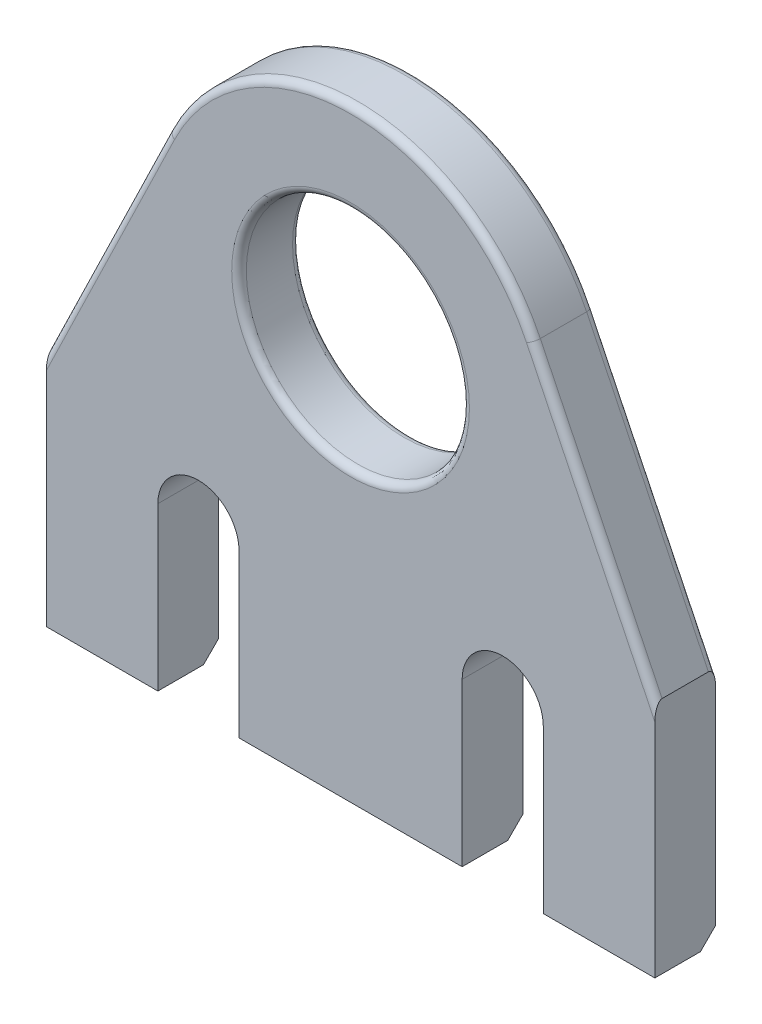
ISO-10303-21;
HEADER;
FILE_DESCRIPTION(('STEP AP214'),'2;1');
FILE_NAME('part.step','',(''),(''),'','','');
FILE_SCHEMA(('AUTOMOTIVE_DESIGN { 1 0 10303 214 1 1 1 1 }'));
ENDSEC;
DATA;
#1=APPLICATION_CONTEXT('core data for automotive mechanical design processes');
#2=APPLICATION_PROTOCOL_DEFINITION('international standard','automotive_design',2000,#1);
#3=PRODUCT_CONTEXT('',#1,'mechanical');
#4=PRODUCT('Part','Part','',(#3));
#5=PRODUCT_RELATED_PRODUCT_CATEGORY('part','',(#4));
#6=PRODUCT_DEFINITION_FORMATION('','',#4);
#7=PRODUCT_DEFINITION_CONTEXT('part definition',#1,'design');
#8=PRODUCT_DEFINITION('design','',#6,#7);
#9=PRODUCT_DEFINITION_SHAPE('','',#8);
#10=(LENGTH_UNIT() NAMED_UNIT(*) SI_UNIT(.MILLI.,.METRE.));
#11=(NAMED_UNIT(*) PLANE_ANGLE_UNIT() SI_UNIT($,.RADIAN.));
#12=(NAMED_UNIT(*) SI_UNIT($,.STERADIAN.) SOLID_ANGLE_UNIT());
#13=UNCERTAINTY_MEASURE_WITH_UNIT(LENGTH_MEASURE(1.E-05),#10,'distance_accuracy_value','');
#14=(GEOMETRIC_REPRESENTATION_CONTEXT(3) GLOBAL_UNCERTAINTY_ASSIGNED_CONTEXT((#13)) GLOBAL_UNIT_ASSIGNED_CONTEXT((#10,
#11,#12)) REPRESENTATION_CONTEXT('',''));
#15=CARTESIAN_POINT('',(0.,0.,0.));
#16=DIRECTION('',(0.,0.,1.));
#17=DIRECTION('',(1.,0.,0.));
#18=AXIS2_PLACEMENT_3D('',#15,#16,#17);
#19=CARTESIAN_POINT('',(-47.625,-74.6252000000001,-19.05));
#20=DIRECTION('',(0.,0.,1.));
#21=DIRECTION('',(1.,0.,0.));
#22=AXIS2_PLACEMENT_3D('',#19,#20,#21);
#23=CYLINDRICAL_SURFACE('',#22,12.7);
#24=CARTESIAN_POINT('',(-47.625,-74.6252000000001,0.));
#25=DIRECTION('',(0.,0.,-1.));
#26=DIRECTION('',(1.,0.,0.));
#27=AXIS2_PLACEMENT_3D('',#24,#25,#26);
#28=CIRCLE('',#27,12.7);
#29=CARTESIAN_POINT('',(-60.325,-74.6252000000001,0.));
#30=VERTEX_POINT('',#29);
#31=CARTESIAN_POINT('',(-34.925,-74.6252000000001,0.));
#32=VERTEX_POINT('',#31);
#33=EDGE_CURVE('E204',#30,#32,#28,.T.);
#34=ORIENTED_EDGE('',*,*,#33,.F.);
#35=DIRECTION('',(0.,0.,1.));
#36=VECTOR('',#35,1.);
#37=CARTESIAN_POINT('',(-60.325,-74.6252000000001,-19.05));
#38=LINE('',#37,#36);
#39=CARTESIAN_POINT('',(-60.325,-74.6252000000001,-19.05));
#40=VERTEX_POINT('',#39);
#41=EDGE_CURVE('E272',#40,#30,#38,.T.);
#42=ORIENTED_EDGE('',*,*,#41,.F.);
#43=CARTESIAN_POINT('',(-47.625,-74.6252000000001,-19.05));
#44=DIRECTION('',(0.,0.,-1.));
#45=DIRECTION('',(1.,0.,0.));
#46=AXIS2_PLACEMENT_3D('',#43,#44,#45);
#47=CIRCLE('',#46,12.7);
#48=CARTESIAN_POINT('',(-34.925,-74.6252000000001,-19.05));
#49=VERTEX_POINT('',#48);
#50=EDGE_CURVE('E207',#40,#49,#47,.T.);
#51=ORIENTED_EDGE('',*,*,#50,.T.);
#52=DIRECTION('',(0.,0.,1.));
#53=VECTOR('',#52,1.);
#54=CARTESIAN_POINT('',(-34.925,-74.6252000000001,-19.05));
#55=LINE('',#54,#53);
#56=EDGE_CURVE('E200',#49,#32,#55,.T.);
#57=ORIENTED_EDGE('',*,*,#56,.T.);
#58=EDGE_LOOP('',(#34,#42,#51,#57));
#59=FACE_BOUND('',#58,.T.);
#60=ADVANCED_FACE('F59',(#59),#23,.F.);
#61=CARTESIAN_POINT('',(-60.325,-74.6252000000001,-19.05));
#62=DIRECTION('',(1.,0.,0.));
#63=DIRECTION('',(0.,1.,0.));
#64=AXIS2_PLACEMENT_3D('',#61,#62,#63);
#65=PLANE('',#64);
#66=DIRECTION('',(0.,0.,1.));
#67=VECTOR('',#66,1.);
#68=CARTESIAN_POINT('',(-60.325,-125.4252,-19.05));
#69=LINE('',#68,#67);
#70=CARTESIAN_POINT('',(-60.325,-125.4252,-14.2748));
#71=VERTEX_POINT('',#70);
#72=CARTESIAN_POINT('',(-60.325,-125.4252,0.));
#73=VERTEX_POINT('',#72);
#74=EDGE_CURVE('E275',#71,#73,#69,.T.);
#75=ORIENTED_EDGE('',*,*,#74,.F.);
#76=DIRECTION('',(0.,0.707106781186548,-0.707106781186546));
#77=VECTOR('',#76,1.);
#78=CARTESIAN_POINT('',(-60.325,-97.6376000000001,-42.0624));
#79=LINE('',#78,#77);
#80=CARTESIAN_POINT('',(-60.325,-120.65,-19.05));
#81=VERTEX_POINT('',#80);
#82=EDGE_CURVE('E326',#71,#81,#79,.T.);
#83=ORIENTED_EDGE('',*,*,#82,.T.);
#84=DIRECTION('',(0.,1.,0.));
#85=VECTOR('',#84,1.);
#86=CARTESIAN_POINT('',(-60.325,-74.6252000000001,-19.05));
#87=LINE('',#86,#85);
#88=EDGE_CURVE('E212',#81,#40,#87,.T.);
#89=ORIENTED_EDGE('',*,*,#88,.T.);
#90=ORIENTED_EDGE('',*,*,#41,.T.);
#91=DIRECTION('',(0.,1.,0.));
#92=VECTOR('',#91,1.);
#93=CARTESIAN_POINT('',(-60.325,-74.6252000000001,0.));
#94=LINE('',#93,#92);
#95=EDGE_CURVE('E227',#73,#30,#94,.T.);
#96=ORIENTED_EDGE('',*,*,#95,.F.);
#97=EDGE_LOOP('',(#75,#83,#89,#90,#96));
#98=FACE_BOUND('',#97,.T.);
#99=ADVANCED_FACE('F454',(#98),#65,.T.);
#100=CARTESIAN_POINT('',(-60.325,-125.4252,-19.05));
#101=DIRECTION('',(0.,-1.,0.));
#102=DIRECTION('',(0.,0.,-1.));
#103=AXIS2_PLACEMENT_3D('',#100,#101,#102);
#104=PLANE('',#103);
#105=DIRECTION('',(0.,0.,1.));
#106=VECTOR('',#105,1.);
#107=CARTESIAN_POINT('',(-95.25,-125.4252,-19.05));
#108=LINE('',#107,#106);
#109=CARTESIAN_POINT('',(-95.25,-125.4252,-14.2748));
#110=VERTEX_POINT('',#109);
#111=CARTESIAN_POINT('',(-95.25,-125.4252,0.));
#112=VERTEX_POINT('',#111);
#113=EDGE_CURVE('E277',#110,#112,#108,.T.);
#114=ORIENTED_EDGE('',*,*,#113,.F.);
#115=DIRECTION('',(1.,0.,0.));
#116=VECTOR('',#115,1.);
#117=CARTESIAN_POINT('',(-60.325,-125.4252,-14.2748));
#118=LINE('',#117,#116);
#119=EDGE_CURVE('E323',#110,#71,#118,.T.);
#120=ORIENTED_EDGE('',*,*,#119,.T.);
#121=ORIENTED_EDGE('',*,*,#74,.T.);
#122=DIRECTION('',(1.,0.,0.));
#123=VECTOR('',#122,1.);
#124=CARTESIAN_POINT('',(-60.325,-125.4252,0.));
#125=LINE('',#124,#123);
#126=EDGE_CURVE('E252',#112,#73,#125,.T.);
#127=ORIENTED_EDGE('',*,*,#126,.F.);
#128=EDGE_LOOP('',(#114,#120,#121,#127));
#129=FACE_BOUND('',#128,.T.);
#130=ADVANCED_FACE('F461',(#129),#104,.T.);
#131=CARTESIAN_POINT('',(-95.25,-125.4252,-19.05));
#132=DIRECTION('',(-1.,0.,0.));
#133=DIRECTION('',(0.,-1.,0.));
#134=AXIS2_PLACEMENT_3D('',#131,#132,#133);
#135=PLANE('',#134);
#136=DIRECTION('',(0.,-1.,0.));
#137=VECTOR('',#136,1.);
#138=CARTESIAN_POINT('',(-95.25,-125.4252,0.));
#139=LINE('',#138,#137);
#140=CARTESIAN_POINT('',(-95.25,-56.0343164939209,0.));
#141=VERTEX_POINT('',#140);
#142=EDGE_CURVE('E250',#141,#112,#139,.T.);
#143=ORIENTED_EDGE('',*,*,#142,.F.);
#144=CARTESIAN_POINT('',(-95.25,-56.0343164939209,-2.28599999999998));
#145=DIRECTION('',(-1.,0.,0.));
#146=DIRECTION('',(0.,-1.,0.));
#147=AXIS2_PLACEMENT_3D('',#144,#145,#146);
#148=ELLIPSE('',#147,5.23431649392085,2.286);
#149=CARTESIAN_POINT('',(-95.25,-50.8,-2.286));
#150=VERTEX_POINT('',#149);
#151=EDGE_CURVE('E351',#141,#150,#148,.T.);
#152=ORIENTED_EDGE('',*,*,#151,.T.);
#153=DIRECTION('',(0.,0.,1.));
#154=VECTOR('',#153,1.);
#155=CARTESIAN_POINT('',(-95.25,-50.8,-19.05));
#156=LINE('',#155,#154);
#157=CARTESIAN_POINT('',(-95.25,-50.8000000000001,-16.764));
#158=VERTEX_POINT('',#157);
#159=EDGE_CURVE('E280',#158,#150,#156,.T.);
#160=ORIENTED_EDGE('',*,*,#159,.F.);
#161=CARTESIAN_POINT('',(-95.25,-56.034316493921,-16.764));
#162=DIRECTION('',(-1.,0.,0.));
#163=DIRECTION('',(0.,1.,0.));
#164=AXIS2_PLACEMENT_3D('',#161,#162,#163);
#165=ELLIPSE('',#164,5.23431649392085,2.286);
#166=CARTESIAN_POINT('',(-95.25,-56.0343164939209,-19.05));
#167=VERTEX_POINT('',#166);
#168=EDGE_CURVE('E349',#158,#167,#165,.T.);
#169=ORIENTED_EDGE('',*,*,#168,.T.);
#170=DIRECTION('',(0.,-1.,0.));
#171=VECTOR('',#170,1.);
#172=CARTESIAN_POINT('',(-95.25,-125.4252,-19.05));
#173=LINE('',#172,#171);
#174=CARTESIAN_POINT('',(-95.25,-120.65,-19.05));
#175=VERTEX_POINT('',#174);
#176=EDGE_CURVE('E269',#167,#175,#173,.T.);
#177=ORIENTED_EDGE('',*,*,#176,.T.);
#178=DIRECTION('',(0.,-0.707106781186548,0.707106781186547));
#179=VECTOR('',#178,1.);
#180=CARTESIAN_POINT('',(-95.25,-123.0376,-16.6624));
#181=LINE('',#180,#179);
#182=EDGE_CURVE('E328',#175,#110,#181,.T.);
#183=ORIENTED_EDGE('',*,*,#182,.T.);
#184=ORIENTED_EDGE('',*,*,#113,.T.);
#185=EDGE_LOOP('',(#143,#152,#160,#169,#177,#183,#184));
#186=FACE_BOUND('',#185,.T.);
#187=ADVANCED_FACE('F448',(#186),#135,.T.);
#188=CARTESIAN_POINT('',(-95.25,-50.8,-19.05));
#189=DIRECTION('',(-0.899591061172803,0.436733239699006,0.));
#190=DIRECTION('',(-0.436733239699006,-0.899591061172803,0.));
#191=AXIS2_PLACEMENT_3D('',#188,#189,#190);
#192=PLANE('',#191);
#193=ORIENTED_EDGE('',*,*,#159,.T.);
#194=DIRECTION('',(-0.436733239699006,-0.899591061172803,0.));
#195=VECTOR('',#194,1.);
#196=CARTESIAN_POINT('',(-95.25,-50.8,-2.28599999999999));
#197=LINE('',#196,#195);
#198=CARTESIAN_POINT('',(-57.124032384473,27.7325607208869,-2.286));
#199=VERTEX_POINT('',#198);
#200=EDGE_CURVE('E355',#150,#199,#197,.F.);
#201=ORIENTED_EDGE('',*,*,#200,.T.);
#202=DIRECTION('',(0.,0.,1.));
#203=VECTOR('',#202,1.);
#204=CARTESIAN_POINT('',(-57.124032384473,27.7325607208869,-19.05));
#205=LINE('',#204,#203);
#206=CARTESIAN_POINT('',(-57.124032384473,27.7325607208869,-16.764));
#207=VERTEX_POINT('',#206);
#208=EDGE_CURVE('E283',#207,#199,#205,.T.);
#209=ORIENTED_EDGE('',*,*,#208,.F.);
#210=DIRECTION('',(-0.436733239699006,-0.899591061172803,0.));
#211=VECTOR('',#210,1.);
#212=CARTESIAN_POINT('',(-95.25,-50.8000000000001,-16.764));
#213=LINE('',#212,#211);
#214=EDGE_CURVE('E353',#207,#158,#213,.T.);
#215=ORIENTED_EDGE('',*,*,#214,.T.);
#216=EDGE_LOOP('',(#193,#201,#209,#215));
#217=FACE_BOUND('',#216,.T.);
#218=ADVANCED_FACE('F380',(#217),#192,.T.);
#219=CARTESIAN_POINT('',(0.,0.,-19.05));
#220=DIRECTION('',(0.,0.,1.));
#221=DIRECTION('',(1.,0.,0.));
#222=AXIS2_PLACEMENT_3D('',#219,#220,#221);
#223=CYLINDRICAL_SURFACE('',#222,63.5);
#224=ORIENTED_EDGE('',*,*,#208,.T.);
#225=CARTESIAN_POINT('',(0.,0.,-2.286));
#226=DIRECTION('',(0.,0.,1.));
#227=DIRECTION('',(1.,0.,0.));
#228=AXIS2_PLACEMENT_3D('',#225,#226,#227);
#229=CIRCLE('',#228,63.5);
#230=CARTESIAN_POINT('',(57.124032384473,27.7325607208867,-2.286));
#231=VERTEX_POINT('',#230);
#232=EDGE_CURVE('E12',#199,#231,#229,.F.);
#233=ORIENTED_EDGE('',*,*,#232,.T.);
#234=DIRECTION('',(0.,0.,1.));
#235=VECTOR('',#234,1.);
#236=CARTESIAN_POINT('',(57.124032384473,27.7325607208867,-19.05));
#237=LINE('',#236,#235);
#238=CARTESIAN_POINT('',(57.124032384473,27.7325607208867,-16.764));
#239=VERTEX_POINT('',#238);
#240=EDGE_CURVE('E286',#239,#231,#237,.T.);
#241=ORIENTED_EDGE('',*,*,#240,.F.);
#242=CARTESIAN_POINT('',(0.,0.,-16.764));
#243=DIRECTION('',(0.,0.,1.));
#244=DIRECTION('',(1.,0.,0.));
#245=AXIS2_PLACEMENT_3D('',#242,#243,#244);
#246=CIRCLE('',#245,63.5);
#247=EDGE_CURVE('E66',#239,#207,#246,.T.);
#248=ORIENTED_EDGE('',*,*,#247,.T.);
#249=EDGE_LOOP('',(#224,#233,#241,#248));
#250=FACE_BOUND('',#249,.T.);
#251=ADVANCED_FACE('F373',(#250),#223,.T.);
#252=CARTESIAN_POINT('',(95.25,-50.8,-19.05));
#253=DIRECTION('',(0.899591061172804,0.436733239699006,0.));
#254=DIRECTION('',(-0.436733239699006,0.899591061172803,0.));
#255=AXIS2_PLACEMENT_3D('',#252,#253,#254);
#256=PLANE('',#255);
#257=ORIENTED_EDGE('',*,*,#240,.T.);
#258=DIRECTION('',(-0.436733239699006,0.899591061172803,0.));
#259=VECTOR('',#258,1.);
#260=CARTESIAN_POINT('',(95.25,-50.8,-2.28600000000001));
#261=LINE('',#260,#259);
#262=CARTESIAN_POINT('',(95.25,-50.8,-2.28600000000001));
#263=VERTEX_POINT('',#262);
#264=EDGE_CURVE('E343',#231,#263,#261,.F.);
#265=ORIENTED_EDGE('',*,*,#264,.T.);
#266=DIRECTION('',(0.,0.,1.));
#267=VECTOR('',#266,1.);
#268=CARTESIAN_POINT('',(95.25,-50.8,-19.05));
#269=LINE('',#268,#267);
#270=CARTESIAN_POINT('',(95.25,-50.8,-16.764));
#271=VERTEX_POINT('',#270);
#272=EDGE_CURVE('E289',#271,#263,#269,.T.);
#273=ORIENTED_EDGE('',*,*,#272,.F.);
#274=DIRECTION('',(-0.436733239699006,0.899591061172803,0.));
#275=VECTOR('',#274,1.);
#276=CARTESIAN_POINT('',(57.124032384473,27.7325607208867,-16.764));
#277=LINE('',#276,#275);
#278=EDGE_CURVE('E340',#271,#239,#277,.T.);
#279=ORIENTED_EDGE('',*,*,#278,.T.);
#280=EDGE_LOOP('',(#257,#265,#273,#279));
#281=FACE_BOUND('',#280,.T.);
#282=ADVANCED_FACE('F504',(#281),#256,.T.);
#283=CARTESIAN_POINT('',(95.25,-125.4252,-19.05));
#284=DIRECTION('',(1.,0.,0.));
#285=DIRECTION('',(0.,1.,0.));
#286=AXIS2_PLACEMENT_3D('',#283,#284,#285);
#287=PLANE('',#286);
#288=ORIENTED_EDGE('',*,*,#272,.T.);
#289=CARTESIAN_POINT('',(95.2499999999999,-56.0343164939208,-2.286));
#290=DIRECTION('',(1.,0.,0.));
#291=DIRECTION('',(0.,1.,0.));
#292=AXIS2_PLACEMENT_3D('',#289,#290,#291);
#293=ELLIPSE('',#292,5.23431649392086,2.286);
#294=CARTESIAN_POINT('',(95.25,-56.0343164939208,0.));
#295=VERTEX_POINT('',#294);
#296=EDGE_CURVE('E347',#263,#295,#293,.T.);
#297=ORIENTED_EDGE('',*,*,#296,.T.);
#298=DIRECTION('',(0.,1.,0.));
#299=VECTOR('',#298,1.);
#300=CARTESIAN_POINT('',(95.25,-125.4252,0.));
#301=LINE('',#300,#299);
#302=CARTESIAN_POINT('',(95.25,-125.4252,0.));
#303=VERTEX_POINT('',#302);
#304=EDGE_CURVE('E248',#303,#295,#301,.T.);
#305=ORIENTED_EDGE('',*,*,#304,.F.);
#306=DIRECTION('',(0.,0.,1.));
#307=VECTOR('',#306,1.);
#308=CARTESIAN_POINT('',(95.25,-125.4252,-19.05));
#309=LINE('',#308,#307);
#310=CARTESIAN_POINT('',(95.25,-125.4252,-14.2748));
#311=VERTEX_POINT('',#310);
#312=EDGE_CURVE('E292',#311,#303,#309,.T.);
#313=ORIENTED_EDGE('',*,*,#312,.F.);
#314=DIRECTION('',(0.,0.707106781186548,-0.707106781186547));
#315=VECTOR('',#314,1.);
#316=CARTESIAN_POINT('',(95.25,-123.0376,-16.6624));
#317=LINE('',#316,#315);
#318=CARTESIAN_POINT('',(95.25,-120.65,-19.05));
#319=VERTEX_POINT('',#318);
#320=EDGE_CURVE('E305',#311,#319,#317,.T.);
#321=ORIENTED_EDGE('',*,*,#320,.T.);
#322=DIRECTION('',(0.,1.,0.));
#323=VECTOR('',#322,1.);
#324=CARTESIAN_POINT('',(95.25,-125.4252,-19.05));
#325=LINE('',#324,#323);
#326=CARTESIAN_POINT('',(95.25,-56.0343164939209,-19.05));
#327=VERTEX_POINT('',#326);
#328=EDGE_CURVE('E266',#319,#327,#325,.T.);
#329=ORIENTED_EDGE('',*,*,#328,.T.);
#330=CARTESIAN_POINT('',(95.25,-56.034316493921,-16.764));
#331=DIRECTION('',(1.,0.,0.));
#332=DIRECTION('',(0.,-1.,0.));
#333=AXIS2_PLACEMENT_3D('',#330,#331,#332);
#334=ELLIPSE('',#333,5.23431649392086,2.286);
#335=EDGE_CURVE('E345',#327,#271,#334,.T.);
#336=ORIENTED_EDGE('',*,*,#335,.T.);
#337=EDGE_LOOP('',(#288,#297,#305,#313,#321,#329,#336));
#338=FACE_BOUND('',#337,.T.);
#339=ADVANCED_FACE('F399',(#338),#287,.T.);
#340=CARTESIAN_POINT('',(60.325,-125.4252,-19.05));
#341=DIRECTION('',(0.,-1.,0.));
#342=DIRECTION('',(1.,0.,0.));
#343=AXIS2_PLACEMENT_3D('',#340,#341,#342);
#344=PLANE('',#343);
#345=DIRECTION('',(0.,0.,1.));
#346=VECTOR('',#345,1.);
#347=CARTESIAN_POINT('',(60.325,-125.4252,-19.05));
#348=LINE('',#347,#346);
#349=CARTESIAN_POINT('',(60.325,-125.4252,-14.2748));
#350=VERTEX_POINT('',#349);
#351=CARTESIAN_POINT('',(60.325,-125.4252,0.));
#352=VERTEX_POINT('',#351);
#353=EDGE_CURVE('E294',#350,#352,#348,.T.);
#354=ORIENTED_EDGE('',*,*,#353,.F.);
#355=DIRECTION('',(1.,0.,0.));
#356=VECTOR('',#355,1.);
#357=CARTESIAN_POINT('',(95.2500000000001,-125.4252,-14.2748));
#358=LINE('',#357,#356);
#359=EDGE_CURVE('E274',#350,#311,#358,.T.);
#360=ORIENTED_EDGE('',*,*,#359,.T.);
#361=ORIENTED_EDGE('',*,*,#312,.T.);
#362=DIRECTION('',(1.,0.,0.));
#363=VECTOR('',#362,1.);
#364=CARTESIAN_POINT('',(60.325,-125.4252,0.));
#365=LINE('',#364,#363);
#366=EDGE_CURVE('E245',#352,#303,#365,.T.);
#367=ORIENTED_EDGE('',*,*,#366,.F.);
#368=EDGE_LOOP('',(#354,#360,#361,#367));
#369=FACE_BOUND('',#368,.T.);
#370=ADVANCED_FACE('F409',(#369),#344,.T.);
#371=CARTESIAN_POINT('',(60.325,-74.6252000000001,-19.05));
#372=DIRECTION('',(-1.,0.,0.));
#373=DIRECTION('',(0.,-1.,0.));
#374=AXIS2_PLACEMENT_3D('',#371,#372,#373);
#375=PLANE('',#374);
#376=DIRECTION('',(0.,-1.,0.));
#377=VECTOR('',#376,1.);
#378=CARTESIAN_POINT('',(60.325,-74.6252000000001,-19.05));
#379=LINE('',#378,#377);
#380=CARTESIAN_POINT('',(60.325,-74.6252000000001,-19.05));
#381=VERTEX_POINT('',#380);
#382=CARTESIAN_POINT('',(60.325,-120.65,-19.05));
#383=VERTEX_POINT('',#382);
#384=EDGE_CURVE('E263',#381,#383,#379,.T.);
#385=ORIENTED_EDGE('',*,*,#384,.T.);
#386=DIRECTION('',(0.,-0.707106781186548,0.707106781186547));
#387=VECTOR('',#386,1.);
#388=CARTESIAN_POINT('',(60.325,-97.6376000000001,-42.0624));
#389=LINE('',#388,#387);
#390=EDGE_CURVE('E314',#383,#350,#389,.T.);
#391=ORIENTED_EDGE('',*,*,#390,.T.);
#392=ORIENTED_EDGE('',*,*,#353,.T.);
#393=DIRECTION('',(0.,-1.,0.));
#394=VECTOR('',#393,1.);
#395=CARTESIAN_POINT('',(60.325,-74.6252000000001,0.));
#396=LINE('',#395,#394);
#397=CARTESIAN_POINT('',(60.325,-74.6252000000001,0.));
#398=VERTEX_POINT('',#397);
#399=EDGE_CURVE('E242',#398,#352,#396,.T.);
#400=ORIENTED_EDGE('',*,*,#399,.F.);
#401=DIRECTION('',(0.,0.,1.));
#402=VECTOR('',#401,1.);
#403=CARTESIAN_POINT('',(60.325,-74.6252000000001,-19.05));
#404=LINE('',#403,#402);
#405=EDGE_CURVE('E296',#381,#398,#404,.T.);
#406=ORIENTED_EDGE('',*,*,#405,.F.);
#407=EDGE_LOOP('',(#385,#391,#392,#400,#406));
#408=FACE_BOUND('',#407,.T.);
#409=ADVANCED_FACE('F413',(#408),#375,.T.);
#410=CARTESIAN_POINT('',(47.625,-74.6252000000001,-19.05));
#411=DIRECTION('',(0.,0.,1.));
#412=DIRECTION('',(1.,0.,0.));
#413=AXIS2_PLACEMENT_3D('',#410,#411,#412);
#414=CYLINDRICAL_SURFACE('',#413,12.7);
#415=CARTESIAN_POINT('',(47.6249999999999,-74.6252000000001,0.));
#416=DIRECTION('',(0.,0.,-1.));
#417=DIRECTION('',(-1.,0.,0.));
#418=AXIS2_PLACEMENT_3D('',#415,#416,#417);
#419=CIRCLE('',#418,12.7);
#420=CARTESIAN_POINT('',(34.925,-74.6252000000001,0.));
#421=VERTEX_POINT('',#420);
#422=EDGE_CURVE('E239',#421,#398,#419,.T.);
#423=ORIENTED_EDGE('',*,*,#422,.F.);
#424=DIRECTION('',(0.,0.,1.));
#425=VECTOR('',#424,1.);
#426=CARTESIAN_POINT('',(34.925,-74.6252000000001,-19.05));
#427=LINE('',#426,#425);
#428=CARTESIAN_POINT('',(34.925,-74.6252000000001,-19.05));
#429=VERTEX_POINT('',#428);
#430=EDGE_CURVE('E298',#429,#421,#427,.T.);
#431=ORIENTED_EDGE('',*,*,#430,.F.);
#432=CARTESIAN_POINT('',(47.625,-74.6252000000001,-19.05));
#433=DIRECTION('',(0.,0.,-1.));
#434=DIRECTION('',(-1.,0.,0.));
#435=AXIS2_PLACEMENT_3D('',#432,#433,#434);
#436=CIRCLE('',#435,12.7);
#437=EDGE_CURVE('E260',#429,#381,#436,.T.);
#438=ORIENTED_EDGE('',*,*,#437,.T.);
#439=ORIENTED_EDGE('',*,*,#405,.T.);
#440=EDGE_LOOP('',(#423,#431,#438,#439));
#441=FACE_BOUND('',#440,.T.);
#442=ADVANCED_FACE('F420',(#441),#414,.F.);
#443=CARTESIAN_POINT('',(34.925,-74.6252000000001,-19.05));
#444=DIRECTION('',(1.,0.,0.));
#445=DIRECTION('',(0.,1.,0.));
#446=AXIS2_PLACEMENT_3D('',#443,#444,#445);
#447=PLANE('',#446);
#448=DIRECTION('',(0.,0.,1.));
#449=VECTOR('',#448,1.);
#450=CARTESIAN_POINT('',(34.925,-125.4252,-19.05));
#451=LINE('',#450,#449);
#452=CARTESIAN_POINT('',(34.925,-125.4252,-14.2748));
#453=VERTEX_POINT('',#452);
#454=CARTESIAN_POINT('',(34.925,-125.4252,0.));
#455=VERTEX_POINT('',#454);
#456=EDGE_CURVE('E300',#453,#455,#451,.T.);
#457=ORIENTED_EDGE('',*,*,#456,.F.);
#458=DIRECTION('',(0.,0.707106781186549,-0.707106781186547));
#459=VECTOR('',#458,1.);
#460=CARTESIAN_POINT('',(34.925,-97.6375999999999,-42.0624));
#461=LINE('',#460,#459);
#462=CARTESIAN_POINT('',(34.925,-120.65,-19.05));
#463=VERTEX_POINT('',#462);
#464=EDGE_CURVE('E319',#453,#463,#461,.T.);
#465=ORIENTED_EDGE('',*,*,#464,.T.);
#466=DIRECTION('',(0.,1.,0.));
#467=VECTOR('',#466,1.);
#468=CARTESIAN_POINT('',(34.925,-74.6252000000001,-19.05));
#469=LINE('',#468,#467);
#470=EDGE_CURVE('E258',#463,#429,#469,.T.);
#471=ORIENTED_EDGE('',*,*,#470,.T.);
#472=ORIENTED_EDGE('',*,*,#430,.T.);
#473=DIRECTION('',(0.,1.,0.));
#474=VECTOR('',#473,1.);
#475=CARTESIAN_POINT('',(34.925,-74.6252000000001,0.));
#476=LINE('',#475,#474);
#477=EDGE_CURVE('E236',#455,#421,#476,.T.);
#478=ORIENTED_EDGE('',*,*,#477,.F.);
#479=EDGE_LOOP('',(#457,#465,#471,#472,#478));
#480=FACE_BOUND('',#479,.T.);
#481=ADVANCED_FACE('F424',(#480),#447,.T.);
#482=CARTESIAN_POINT('',(-34.925,-125.4252,-19.05));
#483=DIRECTION('',(0.,-1.,0.));
#484=DIRECTION('',(0.,0.,-1.));
#485=AXIS2_PLACEMENT_3D('',#482,#483,#484);
#486=PLANE('',#485);
#487=DIRECTION('',(0.,0.,1.));
#488=VECTOR('',#487,1.);
#489=CARTESIAN_POINT('',(-34.925,-125.4252,-19.05));
#490=LINE('',#489,#488);
#491=CARTESIAN_POINT('',(-34.925,-125.4252,-14.2748));
#492=VERTEX_POINT('',#491);
#493=CARTESIAN_POINT('',(-34.925,-125.4252,0.));
#494=VERTEX_POINT('',#493);
#495=EDGE_CURVE('E211',#492,#494,#490,.T.);
#496=ORIENTED_EDGE('',*,*,#495,.F.);
#497=DIRECTION('',(1.,0.,0.));
#498=VECTOR('',#497,1.);
#499=CARTESIAN_POINT('',(34.925,-125.4252,-14.2748));
#500=LINE('',#499,#498);
#501=EDGE_CURVE('E316',#492,#453,#500,.T.);
#502=ORIENTED_EDGE('',*,*,#501,.T.);
#503=ORIENTED_EDGE('',*,*,#456,.T.);
#504=DIRECTION('',(1.,0.,0.));
#505=VECTOR('',#504,1.);
#506=CARTESIAN_POINT('',(-34.925,-125.4252,0.));
#507=LINE('',#506,#505);
#508=EDGE_CURVE('E221',#494,#455,#507,.T.);
#509=ORIENTED_EDGE('',*,*,#508,.F.);
#510=EDGE_LOOP('',(#496,#502,#503,#509));
#511=FACE_BOUND('',#510,.T.);
#512=ADVANCED_FACE('F431',(#511),#486,.T.);
#513=CARTESIAN_POINT('',(-34.925,-74.6252000000001,-19.05));
#514=DIRECTION('',(-1.,0.,0.));
#515=DIRECTION('',(0.,-1.,0.));
#516=AXIS2_PLACEMENT_3D('',#513,#514,#515);
#517=PLANE('',#516);
#518=DIRECTION('',(0.,-1.,0.));
#519=VECTOR('',#518,1.);
#520=CARTESIAN_POINT('',(-34.925,-74.6252000000001,-19.05));
#521=LINE('',#520,#519);
#522=CARTESIAN_POINT('',(-34.925,-120.65,-19.05));
#523=VERTEX_POINT('',#522);
#524=EDGE_CURVE('E256',#49,#523,#521,.T.);
#525=ORIENTED_EDGE('',*,*,#524,.T.);
#526=DIRECTION('',(0.,-0.707106781186549,0.707106781186547));
#527=VECTOR('',#526,1.);
#528=CARTESIAN_POINT('',(-34.925,-97.6376000000001,-42.0624));
#529=LINE('',#528,#527);
#530=EDGE_CURVE('E321',#523,#492,#529,.T.);
#531=ORIENTED_EDGE('',*,*,#530,.T.);
#532=ORIENTED_EDGE('',*,*,#495,.T.);
#533=DIRECTION('',(0.,-1.,0.));
#534=VECTOR('',#533,1.);
#535=CARTESIAN_POINT('',(-34.925,-74.6252000000001,0.));
#536=LINE('',#535,#534);
#537=EDGE_CURVE('E215',#32,#494,#536,.T.);
#538=ORIENTED_EDGE('',*,*,#537,.F.);
#539=ORIENTED_EDGE('',*,*,#56,.F.);
#540=EDGE_LOOP('',(#525,#531,#532,#538,#539));
#541=FACE_BOUND('',#540,.T.);
#542=ADVANCED_FACE('F216',(#541),#517,.T.);
#543=CARTESIAN_POINT('',(-47.625,-74.6252000000001,-19.05));
#544=DIRECTION('',(0.,0.,1.));
#545=DIRECTION('',(1.,0.,0.));
#546=AXIS2_PLACEMENT_3D('',#543,#544,#545);
#547=PLANE('',#546);
#548=CARTESIAN_POINT('',(0.,0.,-19.05));
#549=DIRECTION('',(0.,0.,1.));
#550=DIRECTION('',(1.,0.,0.));
#551=AXIS2_PLACEMENT_3D('',#548,#549,#550);
#552=CIRCLE('',#551,37.211);
#553=CARTESIAN_POINT('',(37.211,0.,-19.05));
#554=VERTEX_POINT('',#553);
#555=EDGE_CURVE('E361',#554,#554,#552,.T.);
#556=ORIENTED_EDGE('',*,*,#555,.T.);
#557=EDGE_LOOP('',(#556));
#558=FACE_BOUND('',#557,.T.);
#559=CARTESIAN_POINT('',(0.,0.,-19.05));
#560=DIRECTION('',(0.,0.,1.));
#561=DIRECTION('',(1.,0.,0.));
#562=AXIS2_PLACEMENT_3D('',#559,#560,#561);
#563=CIRCLE('',#562,61.214);
#564=CARTESIAN_POINT('',(-55.067567218632,26.734188534935,-19.05));
#565=VERTEX_POINT('',#564);
#566=CARTESIAN_POINT('',(55.067567218632,26.734188534935,-19.05));
#567=VERTEX_POINT('',#566);
#568=EDGE_CURVE('E73',#565,#567,#563,.F.);
#569=ORIENTED_EDGE('',*,*,#568,.T.);
#570=DIRECTION('',(-0.436733239699006,0.899591061172803,0.));
#571=VECTOR('',#570,1.);
#572=CARTESIAN_POINT('',(93.193534834159,-51.798372185952,-19.05));
#573=LINE('',#572,#571);
#574=EDGE_CURVE('E359',#567,#327,#573,.F.);
#575=ORIENTED_EDGE('',*,*,#574,.T.);
#576=ORIENTED_EDGE('',*,*,#328,.F.);
#577=DIRECTION('',(-1.,0.,0.));
#578=VECTOR('',#577,1.);
#579=CARTESIAN_POINT('',(60.325,-120.65,-19.05));
#580=LINE('',#579,#578);
#581=EDGE_CURVE('E312',#319,#383,#580,.T.);
#582=ORIENTED_EDGE('',*,*,#581,.T.);
#583=ORIENTED_EDGE('',*,*,#384,.F.);
#584=ORIENTED_EDGE('',*,*,#437,.F.);
#585=ORIENTED_EDGE('',*,*,#470,.F.);
#586=DIRECTION('',(-1.,0.,0.));
#587=VECTOR('',#586,1.);
#588=CARTESIAN_POINT('',(-34.925,-120.65,-19.05));
#589=LINE('',#588,#587);
#590=EDGE_CURVE('E310',#463,#523,#589,.T.);
#591=ORIENTED_EDGE('',*,*,#590,.T.);
#592=ORIENTED_EDGE('',*,*,#524,.F.);
#593=ORIENTED_EDGE('',*,*,#50,.F.);
#594=ORIENTED_EDGE('',*,*,#88,.F.);
#595=DIRECTION('',(-1.,0.,0.));
#596=VECTOR('',#595,1.);
#597=CARTESIAN_POINT('',(-95.25,-120.65,-19.05));
#598=LINE('',#597,#596);
#599=EDGE_CURVE('E307',#81,#175,#598,.T.);
#600=ORIENTED_EDGE('',*,*,#599,.T.);
#601=ORIENTED_EDGE('',*,*,#176,.F.);
#602=DIRECTION('',(-0.436733239699006,-0.899591061172803,0.));
#603=VECTOR('',#602,1.);
#604=CARTESIAN_POINT('',(-55.067567218632,26.734188534935,-19.05));
#605=LINE('',#604,#603);
#606=EDGE_CURVE('E78',#167,#565,#605,.F.);
#607=ORIENTED_EDGE('',*,*,#606,.T.);
#608=EDGE_LOOP('',(#569,#575,#576,#582,#583,#584,#585,#591,#592,#593,#594,#600,#601,#607));
#609=FACE_BOUND('',#608,.T.);
#610=ADVANCED_FACE('F396',(#558,#609),#547,.F.);
#611=CARTESIAN_POINT('',(-47.625,-74.6252000000001,0.));
#612=DIRECTION('',(0.,0.,1.));
#613=DIRECTION('',(1.,0.,0.));
#614=AXIS2_PLACEMENT_3D('',#611,#612,#613);
#615=PLANE('',#614);
#616=CARTESIAN_POINT('',(0.,0.,0.));
#617=DIRECTION('',(0.,0.,1.));
#618=DIRECTION('',(1.,0.,0.));
#619=AXIS2_PLACEMENT_3D('',#616,#617,#618);
#620=CIRCLE('',#619,37.211);
#621=CARTESIAN_POINT('',(37.211,0.,0.));
#622=VERTEX_POINT('',#621);
#623=EDGE_CURVE('E337',#622,#622,#620,.F.);
#624=ORIENTED_EDGE('',*,*,#623,.T.);
#625=EDGE_LOOP('',(#624));
#626=FACE_BOUND('',#625,.T.);
#627=ORIENTED_EDGE('',*,*,#304,.T.);
#628=DIRECTION('',(-0.436733239699006,0.899591061172803,0.));
#629=VECTOR('',#628,1.);
#630=CARTESIAN_POINT('',(75.3026158751225,-14.9463322935717,0.));
#631=LINE('',#630,#629);
#632=CARTESIAN_POINT('',(55.067567218632,26.734188534935,0.));
#633=VERTEX_POINT('',#632);
#634=EDGE_CURVE('E334',#295,#633,#631,.T.);
#635=ORIENTED_EDGE('',*,*,#634,.T.);
#636=CARTESIAN_POINT('',(0.,0.,0.));
#637=DIRECTION('',(0.,0.,1.));
#638=DIRECTION('',(1.,0.,0.));
#639=AXIS2_PLACEMENT_3D('',#636,#637,#638);
#640=CIRCLE('',#639,61.214);
#641=CARTESIAN_POINT('',(-55.067567218632,26.734188534935,0.));
#642=VERTEX_POINT('',#641);
#643=EDGE_CURVE('E330',#633,#642,#640,.T.);
#644=ORIENTED_EDGE('',*,*,#643,.T.);
#645=DIRECTION('',(-0.436733239699006,-0.899591061172803,0.));
#646=VECTOR('',#645,1.);
#647=CARTESIAN_POINT('',(-93.470212508296,-52.3682778854844,0.));
#648=LINE('',#647,#646);
#649=EDGE_CURVE('E332',#642,#141,#648,.T.);
#650=ORIENTED_EDGE('',*,*,#649,.T.);
#651=ORIENTED_EDGE('',*,*,#142,.T.);
#652=ORIENTED_EDGE('',*,*,#126,.T.);
#653=ORIENTED_EDGE('',*,*,#95,.T.);
#654=ORIENTED_EDGE('',*,*,#33,.T.);
#655=ORIENTED_EDGE('',*,*,#537,.T.);
#656=ORIENTED_EDGE('',*,*,#508,.T.);
#657=ORIENTED_EDGE('',*,*,#477,.T.);
#658=ORIENTED_EDGE('',*,*,#422,.T.);
#659=ORIENTED_EDGE('',*,*,#399,.T.);
#660=ORIENTED_EDGE('',*,*,#366,.T.);
#661=EDGE_LOOP('',(#627,#635,#644,#650,#651,#652,#653,#654,#655,#656,#657,#658,#659,#660));
#662=FACE_BOUND('',#661,.T.);
#663=ADVANCED_FACE('F224',(#626,#662),#615,.T.);
#664=CARTESIAN_POINT('',(0.,0.,-19.05));
#665=DIRECTION('',(0.,0.,1.));
#666=DIRECTION('',(1.,0.,0.));
#667=AXIS2_PLACEMENT_3D('',#664,#665,#666);
#668=CYLINDRICAL_SURFACE('',#667,34.925);
#669=CARTESIAN_POINT('',(0.,0.,-2.286));
#670=DIRECTION('',(0.,0.,1.));
#671=DIRECTION('',(1.,0.,0.));
#672=AXIS2_PLACEMENT_3D('',#669,#670,#671);
#673=CIRCLE('',#672,34.925);
#674=CARTESIAN_POINT('',(34.925,0.,-2.286));
#675=VERTEX_POINT('',#674);
#676=EDGE_CURVE('E367',#675,#675,#673,.T.);
#677=CARTESIAN_POINT('',(0.,0.,-16.764));
#678=DIRECTION('',(0.,0.,1.));
#679=DIRECTION('',(1.,0.,0.));
#680=AXIS2_PLACEMENT_3D('',#677,#678,#679);
#681=CIRCLE('',#680,34.925);
#682=CARTESIAN_POINT('',(34.925,0.,-16.764));
#683=VERTEX_POINT('',#682);
#684=EDGE_CURVE('E364',#683,#683,#681,.F.);
#685=CARTESIAN_POINT('',(34.925,0.,-2.286));
#686=CARTESIAN_POINT('',(34.925,0.,-2.4368125));
#687=CARTESIAN_POINT('',(34.925,0.,-2.587625));
#688=CARTESIAN_POINT('',(34.925,0.,-2.88925));
#689=CARTESIAN_POINT('',(34.925,0.,-3.0400625));
#690=CARTESIAN_POINT('',(34.925,0.,-3.3416875));
#691=CARTESIAN_POINT('',(34.925,0.,-3.4925));
#692=CARTESIAN_POINT('',(34.925,0.,-3.794125));
#693=CARTESIAN_POINT('',(34.925,0.,-3.9449375));
#694=CARTESIAN_POINT('',(34.925,0.,-4.2465625));
#695=CARTESIAN_POINT('',(34.925,0.,-4.39737499999999));
#696=CARTESIAN_POINT('',(34.925,0.,-4.699));
#697=CARTESIAN_POINT('',(34.925,0.,-4.8498125));
#698=CARTESIAN_POINT('',(34.925,0.,-5.1514375));
#699=CARTESIAN_POINT('',(34.925,0.,-5.30225));
#700=CARTESIAN_POINT('',(34.925,0.,-5.603875));
#701=CARTESIAN_POINT('',(34.925,0.,-5.7546875));
#702=CARTESIAN_POINT('',(34.925,0.,-6.0563125));
#703=CARTESIAN_POINT('',(34.925,0.,-6.207125));
#704=CARTESIAN_POINT('',(34.925,0.,-6.50875));
#705=CARTESIAN_POINT('',(34.925,0.,-6.6595625));
#706=CARTESIAN_POINT('',(34.925,0.,-6.9611875));
#707=CARTESIAN_POINT('',(34.925,0.,-7.112));
#708=CARTESIAN_POINT('',(34.925,0.,-7.413625));
#709=CARTESIAN_POINT('',(34.925,0.,-7.5644375));
#710=CARTESIAN_POINT('',(34.925,0.,-7.8660625));
#711=CARTESIAN_POINT('',(34.925,0.,-8.016875));
#712=CARTESIAN_POINT('',(34.925,0.,-8.3185));
#713=CARTESIAN_POINT('',(34.925,0.,-8.4693125));
#714=CARTESIAN_POINT('',(34.925,0.,-8.7709375));
#715=CARTESIAN_POINT('',(34.925,0.,-8.92175));
#716=CARTESIAN_POINT('',(34.925,0.,-9.223375));
#717=CARTESIAN_POINT('',(34.925,0.,-9.3741875));
#718=CARTESIAN_POINT('',(34.925,0.,-9.6758125));
#719=CARTESIAN_POINT('',(34.925,0.,-9.826625));
#720=CARTESIAN_POINT('',(34.925,0.,-10.12825));
#721=CARTESIAN_POINT('',(34.925,0.,-10.2790625));
#722=CARTESIAN_POINT('',(34.925,0.,-10.5806875));
#723=CARTESIAN_POINT('',(34.925,0.,-10.7315));
#724=CARTESIAN_POINT('',(34.925,0.,-11.033125));
#725=CARTESIAN_POINT('',(34.925,0.,-11.1839375));
#726=CARTESIAN_POINT('',(34.925,0.,-11.4855625));
#727=CARTESIAN_POINT('',(34.925,0.,-11.636375));
#728=CARTESIAN_POINT('',(34.925,0.,-11.938));
#729=CARTESIAN_POINT('',(34.925,0.,-12.0888125));
#730=CARTESIAN_POINT('',(34.925,0.,-12.3904375));
#731=CARTESIAN_POINT('',(34.925,0.,-12.54125));
#732=CARTESIAN_POINT('',(34.925,0.,-12.842875));
#733=CARTESIAN_POINT('',(34.925,0.,-12.9936875));
#734=CARTESIAN_POINT('',(34.925,0.,-13.2953125));
#735=CARTESIAN_POINT('',(34.925,0.,-13.446125));
#736=CARTESIAN_POINT('',(34.925,0.,-13.74775));
#737=CARTESIAN_POINT('',(34.925,0.,-13.8985625));
#738=CARTESIAN_POINT('',(34.925,0.,-14.2001875));
#739=CARTESIAN_POINT('',(34.925,0.,-14.351));
#740=CARTESIAN_POINT('',(34.925,0.,-14.652625));
#741=CARTESIAN_POINT('',(34.925,0.,-14.8034375));
#742=CARTESIAN_POINT('',(34.925,0.,-15.1050625));
#743=CARTESIAN_POINT('',(34.925,0.,-15.255875));
#744=CARTESIAN_POINT('',(34.925,0.,-15.5575));
#745=CARTESIAN_POINT('',(34.925,0.,-15.7083125));
#746=CARTESIAN_POINT('',(34.925,0.,-16.0099375));
#747=CARTESIAN_POINT('',(34.925,0.,-16.16075));
#748=CARTESIAN_POINT('',(34.925,0.,-16.462375));
#749=CARTESIAN_POINT('',(34.925,0.,-16.6131875));
#750=CARTESIAN_POINT('',(34.925,0.,-16.764));
#751=B_SPLINE_CURVE_WITH_KNOTS('',3,(#685,#686,#687,#688,#689,#690,#691,#692,#693,#694,#695,
#696,#697,#698,#699,#700,#701,#702,#703,#704,#705,#706,#707,#708,#709,#710,#711,#712,#713,#714,
#715,#716,#717,#718,#719,#720,#721,#722,#723,#724,#725,#726,#727,#728,#729,#730,#731,#732,#733,
#734,#735,#736,#737,#738,#739,#740,#741,#742,#743,#744,#745,#746,#747,#748,#749,#750),
.UNSPECIFIED.,.F.,.F.,(4,2,2,2,2,2,2,2,2,2,2,2,2,2,2,2,2,2,2,2,2,2,2,2,2,2,2,2,2,2,2,2,4),(0.,
0.4524375,0.904874999999999,1.3573125,1.80975,2.2621875,2.714625,3.1670625,3.6195,4.0719375,
4.524375,4.9768125,5.42925,5.8816875,6.334125,6.7865625,7.239,7.6914375,8.143875,8.5963125,
9.04875,9.5011875,9.953625,10.4060625,10.8585,11.3109375,11.763375,12.2158125,12.66825,
13.1206875,13.573125,14.0255625,14.478),.UNSPECIFIED.);
#752=EDGE_CURVE('BSEAM586',#675,#683,#751,.T.);
#753=ORIENTED_EDGE('',*,*,#676,.T.);
#754=ORIENTED_EDGE('',*,*,#684,.T.);
#755=ORIENTED_EDGE('',*,*,#752,.T.);
#756=ORIENTED_EDGE('',*,*,#752,.F.);
#757=EDGE_LOOP('',(#753,#755,#754,#756));
#758=FACE_BOUND('',#757,.T.);
#759=ADVANCED_FACE('F586',(#758),#668,.F.);
#760=CARTESIAN_POINT('',(60.325,-125.4252,-14.2748));
#761=DIRECTION('',(0.,-0.707106781186547,-0.707106781186548));
#762=DIRECTION('',(0.,0.707106781186548,-0.707106781186547));
#763=AXIS2_PLACEMENT_3D('',#760,#761,#762);
#764=PLANE('',#763);
#765=ORIENTED_EDGE('',*,*,#390,.F.);
#766=ORIENTED_EDGE('',*,*,#581,.F.);
#767=ORIENTED_EDGE('',*,*,#320,.F.);
#768=ORIENTED_EDGE('',*,*,#359,.F.);
#769=EDGE_LOOP('',(#765,#766,#767,#768));
#770=FACE_BOUND('',#769,.T.);
#771=ADVANCED_FACE('F406',(#770),#764,.T.);
#772=CARTESIAN_POINT('',(-34.925,-125.4252,-14.2748));
#773=DIRECTION('',(0.,-0.707106781186547,-0.707106781186549));
#774=DIRECTION('',(0.,0.707106781186549,-0.707106781186547));
#775=AXIS2_PLACEMENT_3D('',#772,#773,#774);
#776=PLANE('',#775);
#777=ORIENTED_EDGE('',*,*,#530,.F.);
#778=ORIENTED_EDGE('',*,*,#590,.F.);
#779=ORIENTED_EDGE('',*,*,#464,.F.);
#780=ORIENTED_EDGE('',*,*,#501,.F.);
#781=EDGE_LOOP('',(#777,#778,#779,#780));
#782=FACE_BOUND('',#781,.T.);
#783=ADVANCED_FACE('F428',(#782),#776,.T.);
#784=CARTESIAN_POINT('',(-60.325,-125.4252,-14.2748));
#785=DIRECTION('',(0.,-0.707106781186547,-0.707106781186549));
#786=DIRECTION('',(0.,0.707106781186549,-0.707106781186547));
#787=AXIS2_PLACEMENT_3D('',#784,#785,#786);
#788=PLANE('',#787);
#789=ORIENTED_EDGE('',*,*,#182,.F.);
#790=ORIENTED_EDGE('',*,*,#599,.F.);
#791=ORIENTED_EDGE('',*,*,#82,.F.);
#792=ORIENTED_EDGE('',*,*,#119,.F.);
#793=EDGE_LOOP('',(#789,#790,#791,#792));
#794=FACE_BOUND('',#793,.T.);
#795=ADVANCED_FACE('F459',(#794),#788,.T.);
#796=CARTESIAN_POINT('',(-93.470212508296,-52.3682778854844,-2.28599999999999));
#797=DIRECTION('',(-0.436733239699006,-0.899591061172803,0.));
#798=DIRECTION('',(0.899591061172803,-0.436733239699006,0.));
#799=AXIS2_PLACEMENT_3D('',#796,#797,#798);
#800=CYLINDRICAL_SURFACE('',#799,2.286);
#801=ORIENTED_EDGE('',*,*,#151,.F.);
#802=ORIENTED_EDGE('',*,*,#649,.F.);
#803=CARTESIAN_POINT('',(-55.067567218632,26.734188534935,-2.28599999999999));
#804=DIRECTION('',(0.436733239699006,0.899591061172803,0.));
#805=DIRECTION('',(-0.899591061172804,0.436733239699006,0.));
#806=AXIS2_PLACEMENT_3D('',#803,#804,#805);
#807=CIRCLE('',#806,2.286);
#808=EDGE_CURVE('E228',#199,#642,#807,.T.);
#809=ORIENTED_EDGE('',*,*,#808,.F.);
#810=ORIENTED_EDGE('',*,*,#200,.F.);
#811=EDGE_LOOP('',(#801,#802,#809,#810));
#812=FACE_BOUND('',#811,.T.);
#813=ADVANCED_FACE('F446',(#812),#800,.T.);
#814=CARTESIAN_POINT('',(0.,0.,-2.286));
#815=DIRECTION('',(0.,0.,1.));
#816=DIRECTION('',(1.,0.,0.));
#817=AXIS2_PLACEMENT_3D('',#814,#815,#816);
#818=TOROIDAL_SURFACE('',#817,61.214,2.286);
#819=ORIENTED_EDGE('',*,*,#808,.T.);
#820=ORIENTED_EDGE('',*,*,#643,.F.);
#821=CARTESIAN_POINT('',(55.067567218632,26.734188534935,-2.286));
#822=DIRECTION('',(0.436733239699006,-0.899591061172803,0.));
#823=DIRECTION('',(0.899591061172804,0.436733239699006,0.));
#824=AXIS2_PLACEMENT_3D('',#821,#822,#823);
#825=CIRCLE('',#824,2.286);
#826=EDGE_CURVE('E231',#231,#633,#825,.T.);
#827=ORIENTED_EDGE('',*,*,#826,.F.);
#828=ORIENTED_EDGE('',*,*,#232,.F.);
#829=EDGE_LOOP('',(#819,#820,#827,#828));
#830=FACE_BOUND('',#829,.T.);
#831=ADVANCED_FACE('F441',(#830),#818,.T.);
#832=CARTESIAN_POINT('',(75.3026158751225,-14.9463322935717,-2.286));
#833=DIRECTION('',(-0.436733239699006,0.899591061172803,0.));
#834=DIRECTION('',(-0.899591061172804,-0.436733239699006,0.));
#835=AXIS2_PLACEMENT_3D('',#832,#833,#834);
#836=CYLINDRICAL_SURFACE('',#835,2.286);
#837=ORIENTED_EDGE('',*,*,#296,.F.);
#838=ORIENTED_EDGE('',*,*,#264,.F.);
#839=ORIENTED_EDGE('',*,*,#826,.T.);
#840=ORIENTED_EDGE('',*,*,#634,.F.);
#841=EDGE_LOOP('',(#837,#838,#839,#840));
#842=FACE_BOUND('',#841,.T.);
#843=ADVANCED_FACE('F435',(#842),#836,.T.);
#844=CARTESIAN_POINT('',(-93.193534834159,-51.798372185952,-16.764));
#845=DIRECTION('',(0.436733239699006,0.899591061172803,0.));
#846=DIRECTION('',(-0.899591061172803,0.436733239699006,0.));
#847=AXIS2_PLACEMENT_3D('',#844,#845,#846);
#848=CYLINDRICAL_SURFACE('',#847,2.286);
#849=ORIENTED_EDGE('',*,*,#168,.F.);
#850=ORIENTED_EDGE('',*,*,#214,.F.);
#851=CARTESIAN_POINT('',(-55.067567218632,26.734188534935,-16.764));
#852=DIRECTION('',(0.436733239699006,0.899591061172804,0.));
#853=DIRECTION('',(-0.899591061172804,0.436733239699006,0.));
#854=AXIS2_PLACEMENT_3D('',#851,#852,#853);
#855=CIRCLE('',#854,2.286);
#856=EDGE_CURVE('E386',#565,#207,#855,.T.);
#857=ORIENTED_EDGE('',*,*,#856,.F.);
#858=ORIENTED_EDGE('',*,*,#606,.F.);
#859=EDGE_LOOP('',(#849,#850,#857,#858));
#860=FACE_BOUND('',#859,.T.);
#861=ADVANCED_FACE('F385',(#860),#848,.T.);
#862=CARTESIAN_POINT('',(0.,0.,-16.764));
#863=DIRECTION('',(0.,0.,1.));
#864=DIRECTION('',(1.,0.,0.));
#865=AXIS2_PLACEMENT_3D('',#862,#863,#864);
#866=TOROIDAL_SURFACE('',#865,61.214,2.286);
#867=ORIENTED_EDGE('',*,*,#856,.T.);
#868=ORIENTED_EDGE('',*,*,#247,.F.);
#869=CARTESIAN_POINT('',(55.067567218632,26.734188534935,-16.764));
#870=DIRECTION('',(0.436733239699006,-0.899591061172803,0.));
#871=DIRECTION('',(0.899591061172804,0.436733239699006,0.));
#872=AXIS2_PLACEMENT_3D('',#869,#870,#871);
#873=CIRCLE('',#872,2.286);
#874=EDGE_CURVE('E388',#567,#239,#873,.T.);
#875=ORIENTED_EDGE('',*,*,#874,.F.);
#876=ORIENTED_EDGE('',*,*,#568,.F.);
#877=EDGE_LOOP('',(#867,#868,#875,#876));
#878=FACE_BOUND('',#877,.T.);
#879=ADVANCED_FACE('F387',(#878),#866,.T.);
#880=CARTESIAN_POINT('',(93.1935348341589,-51.798372185952,-16.764));
#881=DIRECTION('',(0.436733239699006,-0.899591061172803,0.));
#882=DIRECTION('',(0.899591061172804,0.436733239699006,0.));
#883=AXIS2_PLACEMENT_3D('',#880,#881,#882);
#884=CYLINDRICAL_SURFACE('',#883,2.286);
#885=ORIENTED_EDGE('',*,*,#335,.F.);
#886=ORIENTED_EDGE('',*,*,#574,.F.);
#887=ORIENTED_EDGE('',*,*,#874,.T.);
#888=ORIENTED_EDGE('',*,*,#278,.F.);
#889=EDGE_LOOP('',(#885,#886,#887,#888));
#890=FACE_BOUND('',#889,.T.);
#891=ADVANCED_FACE('F394',(#890),#884,.T.);
#892=CARTESIAN_POINT('',(0.,0.,-2.286));
#893=DIRECTION('',(0.,0.,1.));
#894=DIRECTION('',(1.,0.,0.));
#895=AXIS2_PLACEMENT_3D('',#892,#893,#894);
#896=TOROIDAL_SURFACE('',#895,37.211,2.286);
#897=ORIENTED_EDGE('',*,*,#623,.F.);
#898=EDGE_LOOP('',(#897));
#899=FACE_BOUND('',#898,.T.);
#900=ORIENTED_EDGE('',*,*,#676,.F.);
#901=EDGE_LOOP('',(#900));
#902=FACE_BOUND('',#901,.T.);
#903=ADVANCED_FACE('F669',(#899,#902),#896,.T.);
#904=CARTESIAN_POINT('',(0.,0.,-16.764));
#905=DIRECTION('',(0.,0.,1.));
#906=DIRECTION('',(1.,0.,0.));
#907=AXIS2_PLACEMENT_3D('',#904,#905,#906);
#908=TOROIDAL_SURFACE('',#907,37.211,2.286);
#909=ORIENTED_EDGE('',*,*,#684,.F.);
#910=EDGE_LOOP('',(#909));
#911=FACE_BOUND('',#910,.T.);
#912=ORIENTED_EDGE('',*,*,#555,.F.);
#913=EDGE_LOOP('',(#912));
#914=FACE_BOUND('',#913,.T.);
#915=ADVANCED_FACE('F678',(#911,#914),#908,.T.);
#916=CLOSED_SHELL('',(#60,#99,#130,#187,#218,#251,#282,#339,#370,#409,#442,#481,#512,#542,#610,
#663,#759,#771,#783,#795,#813,#831,#843,#861,#879,#891,#903,#915));
#917=MANIFOLD_SOLID_BREP('B2',#916);
#918=ADVANCED_BREP_SHAPE_REPRESENTATION('',(#18,#917),#14);
#919=SHAPE_DEFINITION_REPRESENTATION(#9,#918);
ENDSEC;
END-ISO-10303-21;
